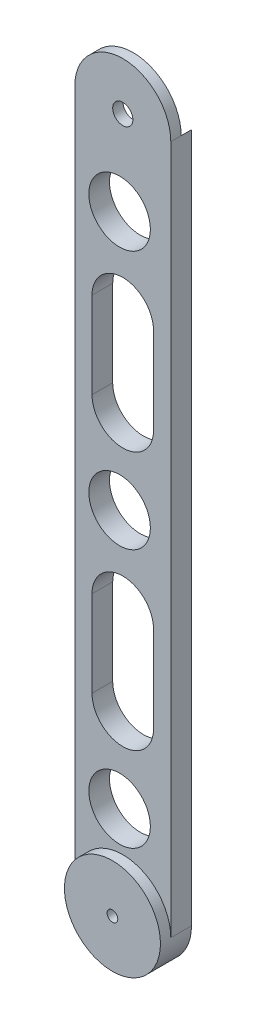
ISO-10303-21;
HEADER;
FILE_DESCRIPTION(('STEP AP214'),'2;1');
FILE_NAME('part.step','',(''),(''),'','','');
FILE_SCHEMA(('AUTOMOTIVE_DESIGN { 1 0 10303 214 1 1 1 1 }'));
ENDSEC;
DATA;
#1=APPLICATION_CONTEXT('core data for automotive mechanical design processes');
#2=APPLICATION_PROTOCOL_DEFINITION('international standard','automotive_design',2000,#1);
#3=PRODUCT_CONTEXT('',#1,'mechanical');
#4=PRODUCT('Part','Part','',(#3));
#5=PRODUCT_RELATED_PRODUCT_CATEGORY('part','',(#4));
#6=PRODUCT_DEFINITION_FORMATION('','',#4);
#7=PRODUCT_DEFINITION_CONTEXT('part definition',#1,'design');
#8=PRODUCT_DEFINITION('design','',#6,#7);
#9=PRODUCT_DEFINITION_SHAPE('','',#8);
#10=(LENGTH_UNIT() NAMED_UNIT(*) SI_UNIT(.MILLI.,.METRE.));
#11=(NAMED_UNIT(*) PLANE_ANGLE_UNIT() SI_UNIT($,.RADIAN.));
#12=(NAMED_UNIT(*) SI_UNIT($,.STERADIAN.) SOLID_ANGLE_UNIT());
#13=UNCERTAINTY_MEASURE_WITH_UNIT(LENGTH_MEASURE(1.E-05),#10,'distance_accuracy_value','');
#14=(GEOMETRIC_REPRESENTATION_CONTEXT(3) GLOBAL_UNCERTAINTY_ASSIGNED_CONTEXT((#13)) GLOBAL_UNIT_ASSIGNED_CONTEXT((#10,
#11,#12)) REPRESENTATION_CONTEXT('',''));
#15=CARTESIAN_POINT('',(0.,0.,0.));
#16=DIRECTION('',(0.,0.,1.));
#17=DIRECTION('',(1.,0.,0.));
#18=AXIS2_PLACEMENT_3D('',#15,#16,#17);
#19=CARTESIAN_POINT('',(3.96645272181372,-172.813095238095,0.));
#20=DIRECTION('',(0.,0.,1.));
#21=DIRECTION('',(1.,0.,0.));
#22=AXIS2_PLACEMENT_3D('',#19,#20,#21);
#23=CYLINDRICAL_SURFACE('',#22,1.55);
#24=CARTESIAN_POINT('',(3.96645272181372,-172.813095238095,9.));
#25=DIRECTION('',(0.,0.,1.));
#26=DIRECTION('',(1.,0.,0.));
#27=AXIS2_PLACEMENT_3D('',#24,#25,#26);
#28=CIRCLE('',#27,1.55);
#29=CARTESIAN_POINT('',(5.51645272181372,-172.813095238095,9.));
#30=VERTEX_POINT('',#29);
#31=EDGE_CURVE('E288',#30,#30,#28,.T.);
#32=ORIENTED_EDGE('',*,*,#31,.T.);
#33=EDGE_LOOP('',(#32));
#34=FACE_BOUND('',#33,.T.);
#35=CARTESIAN_POINT('',(3.96645272181372,-172.813095238095,2.5));
#36=DIRECTION('',(0.,0.,-1.));
#37=DIRECTION('',(-1.,0.,0.));
#38=AXIS2_PLACEMENT_3D('',#35,#36,#37);
#39=CIRCLE('',#38,1.55);
#40=CARTESIAN_POINT('',(2.41645272181372,-172.813095238095,2.5));
#41=VERTEX_POINT('',#40);
#42=EDGE_CURVE('E41',#41,#41,#39,.F.);
#43=ORIENTED_EDGE('',*,*,#42,.F.);
#44=EDGE_LOOP('',(#43));
#45=FACE_BOUND('',#44,.T.);
#46=ADVANCED_FACE('F37',(#34,#45),#23,.F.);
#47=CARTESIAN_POINT('',(3.9664527218137,27.1869047619048,6.));
#48=DIRECTION('',(0.,0.,-1.));
#49=DIRECTION('',(-1.,0.,0.));
#50=AXIS2_PLACEMENT_3D('',#47,#48,#49);
#51=CYLINDRICAL_SURFACE('',#50,13.925);
#52=CARTESIAN_POINT('',(3.9664527218137,27.1869047619048,3.));
#53=DIRECTION('',(0.,0.,-1.));
#54=DIRECTION('',(-1.,0.,0.));
#55=AXIS2_PLACEMENT_3D('',#52,#53,#54);
#56=CIRCLE('',#55,13.925);
#57=CARTESIAN_POINT('',(-9.9585472781863,27.1869047619048,3.));
#58=VERTEX_POINT('',#57);
#59=CARTESIAN_POINT('',(17.8914527218137,27.1869047619048,3.));
#60=VERTEX_POINT('',#59);
#61=EDGE_CURVE('E181',#58,#60,#56,.T.);
#62=ORIENTED_EDGE('',*,*,#61,.F.);
#63=DIRECTION('',(0.,0.,-1.));
#64=VECTOR('',#63,1.);
#65=CARTESIAN_POINT('',(-9.9585472781863,27.1869047619048,6.));
#66=LINE('',#65,#64);
#67=CARTESIAN_POINT('',(-9.9585472781863,27.1869047619048,6.));
#68=VERTEX_POINT('',#67);
#69=EDGE_CURVE('E46',#68,#58,#66,.T.);
#70=ORIENTED_EDGE('',*,*,#69,.F.);
#71=CARTESIAN_POINT('',(3.9664527218137,27.1869047619048,6.));
#72=DIRECTION('',(0.,0.,1.));
#73=DIRECTION('',(1.,0.,0.));
#74=AXIS2_PLACEMENT_3D('',#71,#72,#73);
#75=CIRCLE('',#74,13.925);
#76=CARTESIAN_POINT('',(17.8914527218137,27.1869047619048,6.));
#77=VERTEX_POINT('',#76);
#78=EDGE_CURVE('E269',#77,#68,#75,.T.);
#79=ORIENTED_EDGE('',*,*,#78,.F.);
#80=DIRECTION('',(0.,0.,-1.));
#81=VECTOR('',#80,1.);
#82=CARTESIAN_POINT('',(17.8914527218137,27.1869047619048,6.));
#83=LINE('',#82,#81);
#84=EDGE_CURVE('E11',#77,#60,#83,.T.);
#85=ORIENTED_EDGE('',*,*,#84,.T.);
#86=EDGE_LOOP('',(#62,#70,#79,#85));
#87=FACE_BOUND('',#86,.T.);
#88=ADVANCED_FACE('F335',(#87),#51,.T.);
#89=CARTESIAN_POINT('',(3.9664527218137,27.1869047619048,10.));
#90=DIRECTION('',(0.,0.,-1.));
#91=DIRECTION('',(-1.,0.,0.));
#92=AXIS2_PLACEMENT_3D('',#89,#90,#91);
#93=CYLINDRICAL_SURFACE('',#92,2.925);
#94=CARTESIAN_POINT('',(3.9664527218137,27.1869047619048,6.));
#95=DIRECTION('',(0.,0.,1.));
#96=DIRECTION('',(1.,0.,0.));
#97=AXIS2_PLACEMENT_3D('',#94,#95,#96);
#98=CIRCLE('',#97,2.925);
#99=CARTESIAN_POINT('',(6.8914527218137,27.1869047619048,6.));
#100=VERTEX_POINT('',#99);
#101=EDGE_CURVE('E144',#100,#100,#98,.T.);
#102=ORIENTED_EDGE('',*,*,#101,.T.);
#103=EDGE_LOOP('',(#102));
#104=FACE_BOUND('',#103,.T.);
#105=CARTESIAN_POINT('',(3.9664527218137,27.1869047619048,3.));
#106=DIRECTION('',(0.,0.,-1.));
#107=DIRECTION('',(-1.,0.,0.));
#108=AXIS2_PLACEMENT_3D('',#105,#106,#107);
#109=CIRCLE('',#108,2.925);
#110=CARTESIAN_POINT('',(1.0414527218137,27.1869047619048,3.));
#111=VERTEX_POINT('',#110);
#112=EDGE_CURVE('E145',#111,#111,#109,.F.);
#113=ORIENTED_EDGE('',*,*,#112,.F.);
#114=EDGE_LOOP('',(#113));
#115=FACE_BOUND('',#114,.T.);
#116=ADVANCED_FACE('F340',(#104,#115),#93,.F.);
#117=CARTESIAN_POINT('',(0.,0.,6.));
#118=DIRECTION('',(0.,0.,1.));
#119=DIRECTION('',(1.,0.,0.));
#120=AXIS2_PLACEMENT_3D('',#117,#118,#119);
#121=PLANE('',#120);
#122=ORIENTED_EDGE('',*,*,#101,.F.);
#123=EDGE_LOOP('',(#122));
#124=FACE_BOUND('',#123,.T.);
#125=CARTESIAN_POINT('',(3.04057135861746,-147.813095238095,6.));
#126=DIRECTION('',(0.,0.,1.));
#127=DIRECTION('',(1.,0.,0.));
#128=AXIS2_PLACEMENT_3D('',#125,#126,#127);
#129=CIRCLE('',#128,8.925);
#130=CARTESIAN_POINT('',(11.9655713586175,-147.813095238095,6.));
#131=VERTEX_POINT('',#130);
#132=EDGE_CURVE('E195',#131,#131,#129,.T.);
#133=ORIENTED_EDGE('',*,*,#132,.F.);
#134=EDGE_LOOP('',(#133));
#135=FACE_BOUND('',#134,.T.);
#136=CARTESIAN_POINT('',(3.9664527218137,-122.813095238095,6.));
#137=DIRECTION('',(0.,0.,1.));
#138=DIRECTION('',(1.,0.,0.));
#139=AXIS2_PLACEMENT_3D('',#136,#137,#138);
#140=CIRCLE('',#139,8.925);
#141=CARTESIAN_POINT('',(12.8914527218137,-122.813095238095,6.));
#142=VERTEX_POINT('',#141);
#143=CARTESIAN_POINT('',(-4.9585472781863,-122.813095238095,6.));
#144=VERTEX_POINT('',#143);
#145=EDGE_CURVE('E220',#142,#144,#140,.F.);
#146=ORIENTED_EDGE('',*,*,#145,.T.);
#147=DIRECTION('',(0.,1.,0.));
#148=VECTOR('',#147,1.);
#149=CARTESIAN_POINT('',(-4.95854727818629,0.,6.));
#150=LINE('',#149,#148);
#151=CARTESIAN_POINT('',(-4.9585472781863,-97.8130952380952,6.));
#152=VERTEX_POINT('',#151);
#153=EDGE_CURVE('E223',#144,#152,#150,.T.);
#154=ORIENTED_EDGE('',*,*,#153,.T.);
#155=CARTESIAN_POINT('',(3.9664527218137,-97.8130952380952,6.));
#156=DIRECTION('',(0.,0.,1.));
#157=DIRECTION('',(1.,0.,0.));
#158=AXIS2_PLACEMENT_3D('',#155,#156,#157);
#159=CIRCLE('',#158,8.925);
#160=CARTESIAN_POINT('',(12.8914527218137,-97.8130952380952,6.));
#161=VERTEX_POINT('',#160);
#162=EDGE_CURVE('E211',#152,#161,#159,.F.);
#163=ORIENTED_EDGE('',*,*,#162,.T.);
#164=DIRECTION('',(0.,1.,0.));
#165=VECTOR('',#164,1.);
#166=CARTESIAN_POINT('',(12.8914527218137,0.,6.));
#167=LINE('',#166,#165);
#168=EDGE_CURVE('E218',#142,#161,#167,.T.);
#169=ORIENTED_EDGE('',*,*,#168,.F.);
#170=EDGE_LOOP('',(#146,#154,#163,#169));
#171=FACE_BOUND('',#170,.T.);
#172=CARTESIAN_POINT('',(3.04057135861746,-72.8130952380952,6.));
#173=DIRECTION('',(0.,0.,1.));
#174=DIRECTION('',(1.,0.,0.));
#175=AXIS2_PLACEMENT_3D('',#172,#173,#174);
#176=CIRCLE('',#175,8.925);
#177=CARTESIAN_POINT('',(11.9655713586175,-72.8130952380952,6.));
#178=VERTEX_POINT('',#177);
#179=EDGE_CURVE('E229',#178,#178,#176,.T.);
#180=ORIENTED_EDGE('',*,*,#179,.F.);
#181=EDGE_LOOP('',(#180));
#182=FACE_BOUND('',#181,.T.);
#183=CARTESIAN_POINT('',(3.04057135861746,2.1869047619048,6.));
#184=DIRECTION('',(0.,0.,1.));
#185=DIRECTION('',(1.,0.,0.));
#186=AXIS2_PLACEMENT_3D('',#183,#184,#185);
#187=CIRCLE('',#186,8.925);
#188=CARTESIAN_POINT('',(11.9655713586175,2.1869047619048,6.));
#189=VERTEX_POINT('',#188);
#190=EDGE_CURVE('E167',#189,#189,#187,.T.);
#191=ORIENTED_EDGE('',*,*,#190,.F.);
#192=EDGE_LOOP('',(#191));
#193=FACE_BOUND('',#192,.T.);
#194=CARTESIAN_POINT('',(3.96645272181372,-172.813095238095,6.));
#195=DIRECTION('',(0.,0.,1.));
#196=DIRECTION('',(1.,0.,0.));
#197=AXIS2_PLACEMENT_3D('',#194,#195,#196);
#198=CIRCLE('',#197,13.925);
#199=CARTESIAN_POINT('',(17.8914527218137,-172.813095238095,6.));
#200=VERTEX_POINT('',#199);
#201=CARTESIAN_POINT('',(-9.95854727818629,-172.813095238095,6.));
#202=VERTEX_POINT('',#201);
#203=EDGE_CURVE('E162',#200,#202,#198,.T.);
#204=ORIENTED_EDGE('',*,*,#203,.F.);
#205=DIRECTION('',(0.,-1.,0.));
#206=VECTOR('',#205,1.);
#207=CARTESIAN_POINT('',(17.8914527218137,0.,6.));
#208=LINE('',#207,#206);
#209=EDGE_CURVE('E174',#77,#200,#208,.T.);
#210=ORIENTED_EDGE('',*,*,#209,.F.);
#211=ORIENTED_EDGE('',*,*,#78,.T.);
#212=DIRECTION('',(0.,-1.,0.));
#213=VECTOR('',#212,1.);
#214=CARTESIAN_POINT('',(-9.95854727818629,0.,6.));
#215=LINE('',#214,#213);
#216=EDGE_CURVE('E170',#68,#202,#215,.T.);
#217=ORIENTED_EDGE('',*,*,#216,.T.);
#218=EDGE_LOOP('',(#204,#210,#211,#217));
#219=FACE_BOUND('',#218,.T.);
#220=DIRECTION('',(0.,1.,0.));
#221=VECTOR('',#220,1.);
#222=CARTESIAN_POINT('',(-4.95854727818629,0.,6.));
#223=LINE('',#222,#221);
#224=CARTESIAN_POINT('',(-4.9585472781863,-47.8130952380952,6.));
#225=VERTEX_POINT('',#224);
#226=CARTESIAN_POINT('',(-4.9585472781863,-22.8130952380952,6.));
#227=VERTEX_POINT('',#226);
#228=EDGE_CURVE('E258',#225,#227,#223,.T.);
#229=ORIENTED_EDGE('',*,*,#228,.T.);
#230=CARTESIAN_POINT('',(3.9664527218137,-22.8130952380952,6.));
#231=DIRECTION('',(0.,0.,1.));
#232=DIRECTION('',(1.,0.,0.));
#233=AXIS2_PLACEMENT_3D('',#230,#231,#232);
#234=CIRCLE('',#233,8.925);
#235=CARTESIAN_POINT('',(12.8914527218137,-22.8130952380952,6.));
#236=VERTEX_POINT('',#235);
#237=EDGE_CURVE('E261',#227,#236,#234,.F.);
#238=ORIENTED_EDGE('',*,*,#237,.T.);
#239=DIRECTION('',(0.,1.,0.));
#240=VECTOR('',#239,1.);
#241=CARTESIAN_POINT('',(12.8914527218137,0.,6.));
#242=LINE('',#241,#240);
#243=CARTESIAN_POINT('',(12.8914527218137,-47.8130952380952,6.));
#244=VERTEX_POINT('',#243);
#245=EDGE_CURVE('E247',#244,#236,#242,.T.);
#246=ORIENTED_EDGE('',*,*,#245,.F.);
#247=CARTESIAN_POINT('',(3.9664527218137,-47.8130952380952,6.));
#248=DIRECTION('',(0.,0.,1.));
#249=DIRECTION('',(1.,0.,0.));
#250=AXIS2_PLACEMENT_3D('',#247,#248,#249);
#251=CIRCLE('',#250,8.925);
#252=EDGE_CURVE('E255',#244,#225,#251,.F.);
#253=ORIENTED_EDGE('',*,*,#252,.T.);
#254=EDGE_LOOP('',(#229,#238,#246,#253));
#255=FACE_BOUND('',#254,.T.);
#256=ADVANCED_FACE('F276',(#124,#135,#171,#182,#193,#219,#255),#121,.T.);
#257=CARTESIAN_POINT('',(0.,0.,0.));
#258=DIRECTION('',(0.,0.,1.));
#259=DIRECTION('',(1.,0.,0.));
#260=AXIS2_PLACEMENT_3D('',#257,#258,#259);
#261=PLANE('',#260);
#262=CARTESIAN_POINT('',(3.96645272181372,-172.813095238095,0.));
#263=DIRECTION('',(0.,0.,-1.));
#264=DIRECTION('',(-1.,0.,0.));
#265=AXIS2_PLACEMENT_3D('',#262,#263,#264);
#266=CIRCLE('',#265,4.);
#267=CARTESIAN_POINT('',(-0.0335472781862771,-172.813095238095,0.));
#268=VERTEX_POINT('',#267);
#269=EDGE_CURVE('E295',#268,#268,#266,.T.);
#270=ORIENTED_EDGE('',*,*,#269,.F.);
#271=EDGE_LOOP('',(#270));
#272=FACE_BOUND('',#271,.T.);
#273=CARTESIAN_POINT('',(3.04057135861746,-147.813095238095,0.));
#274=DIRECTION('',(0.,0.,-1.));
#275=DIRECTION('',(-1.,0.,0.));
#276=AXIS2_PLACEMENT_3D('',#273,#274,#275);
#277=CIRCLE('',#276,8.925);
#278=CARTESIAN_POINT('',(-5.88442864138254,-147.813095238095,0.));
#279=VERTEX_POINT('',#278);
#280=EDGE_CURVE('E192',#279,#279,#277,.T.);
#281=ORIENTED_EDGE('',*,*,#280,.F.);
#282=EDGE_LOOP('',(#281));
#283=FACE_BOUND('',#282,.T.);
#284=DIRECTION('',(0.,-1.,0.));
#285=VECTOR('',#284,1.);
#286=CARTESIAN_POINT('',(-4.95854727818629,0.,0.));
#287=LINE('',#286,#285);
#288=CARTESIAN_POINT('',(-4.9585472781863,-97.8130952380952,0.));
#289=VERTEX_POINT('',#288);
#290=CARTESIAN_POINT('',(-4.9585472781863,-122.813095238095,0.));
#291=VERTEX_POINT('',#290);
#292=EDGE_CURVE('E62',#289,#291,#287,.T.);
#293=ORIENTED_EDGE('',*,*,#292,.T.);
#294=CARTESIAN_POINT('',(3.9664527218137,-122.813095238095,0.));
#295=DIRECTION('',(0.,0.,-1.));
#296=DIRECTION('',(-1.,0.,0.));
#297=AXIS2_PLACEMENT_3D('',#294,#295,#296);
#298=CIRCLE('',#297,8.925);
#299=CARTESIAN_POINT('',(12.8914527218137,-122.813095238095,0.));
#300=VERTEX_POINT('',#299);
#301=EDGE_CURVE('E205',#291,#300,#298,.F.);
#302=ORIENTED_EDGE('',*,*,#301,.T.);
#303=DIRECTION('',(0.,-1.,0.));
#304=VECTOR('',#303,1.);
#305=CARTESIAN_POINT('',(12.8914527218137,0.,0.));
#306=LINE('',#305,#304);
#307=CARTESIAN_POINT('',(12.8914527218137,-97.8130952380952,0.));
#308=VERTEX_POINT('',#307);
#309=EDGE_CURVE('E202',#308,#300,#306,.T.);
#310=ORIENTED_EDGE('',*,*,#309,.F.);
#311=CARTESIAN_POINT('',(3.9664527218137,-97.8130952380952,0.));
#312=DIRECTION('',(0.,0.,-1.));
#313=DIRECTION('',(-1.,0.,0.));
#314=AXIS2_PLACEMENT_3D('',#311,#312,#313);
#315=CIRCLE('',#314,8.925);
#316=EDGE_CURVE('E199',#308,#289,#315,.F.);
#317=ORIENTED_EDGE('',*,*,#316,.T.);
#318=EDGE_LOOP('',(#293,#302,#310,#317));
#319=FACE_BOUND('',#318,.T.);
#320=CARTESIAN_POINT('',(3.04057135861746,-72.8130952380952,0.));
#321=DIRECTION('',(0.,0.,-1.));
#322=DIRECTION('',(-1.,0.,0.));
#323=AXIS2_PLACEMENT_3D('',#320,#321,#322);
#324=CIRCLE('',#323,8.925);
#325=CARTESIAN_POINT('',(-5.88442864138254,-72.8130952380952,0.));
#326=VERTEX_POINT('',#325);
#327=EDGE_CURVE('E226',#326,#326,#324,.T.);
#328=ORIENTED_EDGE('',*,*,#327,.F.);
#329=EDGE_LOOP('',(#328));
#330=FACE_BOUND('',#329,.T.);
#331=DIRECTION('',(0.,-1.,0.));
#332=VECTOR('',#331,1.);
#333=CARTESIAN_POINT('',(-9.95854727818629,0.,0.));
#334=LINE('',#333,#332);
#335=CARTESIAN_POINT('',(-9.9585472781863,27.1869047619048,0.));
#336=VERTEX_POINT('',#335);
#337=CARTESIAN_POINT('',(-9.95854727818627,-172.813095238095,0.));
#338=VERTEX_POINT('',#337);
#339=EDGE_CURVE('E155',#336,#338,#334,.T.);
#340=ORIENTED_EDGE('',*,*,#339,.F.);
#341=CARTESIAN_POINT('',(3.9664527218137,27.1869047619048,0.));
#342=DIRECTION('',(0.,0.,-1.));
#343=DIRECTION('',(-1.,0.,0.));
#344=AXIS2_PLACEMENT_3D('',#341,#342,#343);
#345=CIRCLE('',#344,13.925);
#346=CARTESIAN_POINT('',(17.8914527218137,27.1869047619048,0.));
#347=VERTEX_POINT('',#346);
#348=EDGE_CURVE('E137',#347,#336,#345,.T.);
#349=ORIENTED_EDGE('',*,*,#348,.F.);
#350=DIRECTION('',(0.,-1.,0.));
#351=VECTOR('',#350,1.);
#352=CARTESIAN_POINT('',(17.8914527218137,0.,0.));
#353=LINE('',#352,#351);
#354=CARTESIAN_POINT('',(17.8914527218137,-172.813095238095,0.));
#355=VERTEX_POINT('',#354);
#356=EDGE_CURVE('E153',#347,#355,#353,.T.);
#357=ORIENTED_EDGE('',*,*,#356,.T.);
#358=CARTESIAN_POINT('',(3.96645272181372,-172.813095238095,0.));
#359=DIRECTION('',(0.,0.,1.));
#360=DIRECTION('',(1.,0.,0.));
#361=AXIS2_PLACEMENT_3D('',#358,#359,#360);
#362=CIRCLE('',#361,13.925);
#363=EDGE_CURVE('E164',#338,#355,#362,.T.);
#364=ORIENTED_EDGE('',*,*,#363,.F.);
#365=EDGE_LOOP('',(#340,#349,#357,#364));
#366=FACE_BOUND('',#365,.T.);
#367=CARTESIAN_POINT('',(3.04057135861746,2.1869047619048,0.));
#368=DIRECTION('',(0.,0.,-1.));
#369=DIRECTION('',(-1.,0.,0.));
#370=AXIS2_PLACEMENT_3D('',#367,#368,#369);
#371=CIRCLE('',#370,8.925);
#372=CARTESIAN_POINT('',(-5.88442864138254,2.1869047619048,0.));
#373=VERTEX_POINT('',#372);
#374=EDGE_CURVE('E264',#373,#373,#371,.T.);
#375=ORIENTED_EDGE('',*,*,#374,.F.);
#376=EDGE_LOOP('',(#375));
#377=FACE_BOUND('',#376,.T.);
#378=CARTESIAN_POINT('',(3.9664527218137,-22.8130952380952,0.));
#379=DIRECTION('',(0.,0.,-1.));
#380=DIRECTION('',(-1.,0.,0.));
#381=AXIS2_PLACEMENT_3D('',#378,#379,#380);
#382=CIRCLE('',#381,8.925);
#383=CARTESIAN_POINT('',(12.8914527218137,-22.8130952380952,0.));
#384=VERTEX_POINT('',#383);
#385=CARTESIAN_POINT('',(-4.9585472781863,-22.8130952380952,0.));
#386=VERTEX_POINT('',#385);
#387=EDGE_CURVE('E232',#384,#386,#382,.F.);
#388=ORIENTED_EDGE('',*,*,#387,.T.);
#389=DIRECTION('',(0.,-1.,0.));
#390=VECTOR('',#389,1.);
#391=CARTESIAN_POINT('',(-4.95854727818629,0.,0.));
#392=LINE('',#391,#390);
#393=CARTESIAN_POINT('',(-4.9585472781863,-47.8130952380952,0.));
#394=VERTEX_POINT('',#393);
#395=EDGE_CURVE('E241',#386,#394,#392,.T.);
#396=ORIENTED_EDGE('',*,*,#395,.T.);
#397=CARTESIAN_POINT('',(3.9664527218137,-47.8130952380952,0.));
#398=DIRECTION('',(0.,0.,-1.));
#399=DIRECTION('',(-1.,0.,0.));
#400=AXIS2_PLACEMENT_3D('',#397,#398,#399);
#401=CIRCLE('',#400,8.925);
#402=CARTESIAN_POINT('',(12.8914527218137,-47.8130952380952,0.));
#403=VERTEX_POINT('',#402);
#404=EDGE_CURVE('E238',#394,#403,#401,.F.);
#405=ORIENTED_EDGE('',*,*,#404,.T.);
#406=DIRECTION('',(0.,-1.,0.));
#407=VECTOR('',#406,1.);
#408=CARTESIAN_POINT('',(12.8914527218137,0.,0.));
#409=LINE('',#408,#407);
#410=EDGE_CURVE('E235',#384,#403,#409,.T.);
#411=ORIENTED_EDGE('',*,*,#410,.F.);
#412=EDGE_LOOP('',(#388,#396,#405,#411));
#413=FACE_BOUND('',#412,.T.);
#414=ADVANCED_FACE('F150',(#272,#283,#319,#330,#366,#377,#413),#261,.F.);
#415=CARTESIAN_POINT('',(3.96645272181372,-172.813095238095,6.));
#416=DIRECTION('',(0.,0.,-1.));
#417=DIRECTION('',(-1.,0.,0.));
#418=AXIS2_PLACEMENT_3D('',#415,#416,#417);
#419=CYLINDRICAL_SURFACE('',#418,13.925);
#420=ORIENTED_EDGE('',*,*,#363,.T.);
#421=DIRECTION('',(0.,0.,-1.));
#422=VECTOR('',#421,1.);
#423=CARTESIAN_POINT('',(17.8914527218137,-172.813095238095,6.));
#424=LINE('',#423,#422);
#425=EDGE_CURVE('E160',#200,#355,#424,.T.);
#426=ORIENTED_EDGE('',*,*,#425,.F.);
#427=ORIENTED_EDGE('',*,*,#203,.T.);
#428=DIRECTION('',(0.,0.,-1.));
#429=VECTOR('',#428,1.);
#430=CARTESIAN_POINT('',(-9.95854727818627,-172.813095238095,6.));
#431=LINE('',#430,#429);
#432=EDGE_CURVE('E176',#202,#338,#431,.T.);
#433=ORIENTED_EDGE('',*,*,#432,.T.);
#434=EDGE_LOOP('',(#420,#426,#427,#433));
#435=FACE_BOUND('',#434,.T.);
#436=CARTESIAN_POINT('',(3.96645272181372,-172.813095238095,9.));
#437=DIRECTION('',(0.,0.,1.));
#438=DIRECTION('',(1.,0.,0.));
#439=AXIS2_PLACEMENT_3D('',#436,#437,#438);
#440=CIRCLE('',#439,13.925);
#441=CARTESIAN_POINT('',(17.8914527218137,-172.813095238095,9.));
#442=VERTEX_POINT('',#441);
#443=EDGE_CURVE('E156',#442,#442,#440,.T.);
#444=ORIENTED_EDGE('',*,*,#443,.F.);
#445=EDGE_LOOP('',(#444));
#446=FACE_BOUND('',#445,.T.);
#447=ADVANCED_FACE('F281',(#435,#446),#419,.T.);
#448=CARTESIAN_POINT('',(17.8914527218137,0.,6.));
#449=DIRECTION('',(1.,0.,0.));
#450=DIRECTION('',(0.,1.,0.));
#451=AXIS2_PLACEMENT_3D('',#448,#449,#450);
#452=PLANE('',#451);
#453=ORIENTED_EDGE('',*,*,#356,.F.);
#454=DIRECTION('',(0.,0.,-1.));
#455=VECTOR('',#454,1.);
#456=CARTESIAN_POINT('',(17.8914527218137,27.1869047619048,3.));
#457=LINE('',#456,#455);
#458=EDGE_CURVE('E134',#60,#347,#457,.T.);
#459=ORIENTED_EDGE('',*,*,#458,.F.);
#460=ORIENTED_EDGE('',*,*,#84,.F.);
#461=ORIENTED_EDGE('',*,*,#209,.T.);
#462=ORIENTED_EDGE('',*,*,#425,.T.);
#463=EDGE_LOOP('',(#453,#459,#460,#461,#462));
#464=FACE_BOUND('',#463,.T.);
#465=ADVANCED_FACE('F39',(#464),#452,.T.);
#466=CARTESIAN_POINT('',(-9.95854727818629,0.,6.));
#467=DIRECTION('',(1.,0.,0.));
#468=DIRECTION('',(0.,1.,0.));
#469=AXIS2_PLACEMENT_3D('',#466,#467,#468);
#470=PLANE('',#469);
#471=ORIENTED_EDGE('',*,*,#339,.T.);
#472=ORIENTED_EDGE('',*,*,#432,.F.);
#473=ORIENTED_EDGE('',*,*,#216,.F.);
#474=ORIENTED_EDGE('',*,*,#69,.T.);
#475=EDGE_CURVE('E178',#58,#336,#66,.T.);
#476=ORIENTED_EDGE('',*,*,#475,.T.);
#477=EDGE_LOOP('',(#471,#472,#473,#474,#476));
#478=FACE_BOUND('',#477,.T.);
#479=ADVANCED_FACE('F279',(#478),#470,.F.);
#480=CARTESIAN_POINT('',(3.04057135861746,2.1869047619048,10.));
#481=DIRECTION('',(0.,0.,-1.));
#482=DIRECTION('',(-1.,0.,0.));
#483=AXIS2_PLACEMENT_3D('',#480,#481,#482);
#484=CYLINDRICAL_SURFACE('',#483,8.925);
#485=ORIENTED_EDGE('',*,*,#190,.T.);
#486=EDGE_LOOP('',(#485));
#487=FACE_BOUND('',#486,.T.);
#488=ORIENTED_EDGE('',*,*,#374,.T.);
#489=EDGE_LOOP('',(#488));
#490=FACE_BOUND('',#489,.T.);
#491=ADVANCED_FACE('F345',(#487,#490),#484,.F.);
#492=CARTESIAN_POINT('',(3.9664527218137,-22.8130952380952,10.));
#493=DIRECTION('',(0.,0.,-1.));
#494=DIRECTION('',(-1.,0.,0.));
#495=AXIS2_PLACEMENT_3D('',#492,#493,#494);
#496=CYLINDRICAL_SURFACE('',#495,8.925);
#497=DIRECTION('',(0.,0.,-1.));
#498=VECTOR('',#497,1.);
#499=CARTESIAN_POINT('',(-4.9585472781863,-22.8130952380952,10.));
#500=LINE('',#499,#498);
#501=EDGE_CURVE('E245',#227,#386,#500,.T.);
#502=ORIENTED_EDGE('',*,*,#501,.T.);
#503=ORIENTED_EDGE('',*,*,#387,.F.);
#504=DIRECTION('',(0.,0.,-1.));
#505=VECTOR('',#504,1.);
#506=CARTESIAN_POINT('',(12.8914527218137,-22.8130952380952,10.));
#507=LINE('',#506,#505);
#508=EDGE_CURVE('E244',#236,#384,#507,.T.);
#509=ORIENTED_EDGE('',*,*,#508,.F.);
#510=ORIENTED_EDGE('',*,*,#237,.F.);
#511=EDGE_LOOP('',(#502,#503,#509,#510));
#512=FACE_BOUND('',#511,.T.);
#513=ADVANCED_FACE('F355',(#512),#496,.F.);
#514=CARTESIAN_POINT('',(-4.95854727818629,0.,10.));
#515=DIRECTION('',(1.,0.,0.));
#516=DIRECTION('',(0.,1.,0.));
#517=AXIS2_PLACEMENT_3D('',#514,#515,#516);
#518=PLANE('',#517);
#519=DIRECTION('',(0.,0.,-1.));
#520=VECTOR('',#519,1.);
#521=CARTESIAN_POINT('',(-4.9585472781863,-47.8130952380952,10.));
#522=LINE('',#521,#520);
#523=EDGE_CURVE('E248',#225,#394,#522,.T.);
#524=ORIENTED_EDGE('',*,*,#523,.T.);
#525=ORIENTED_EDGE('',*,*,#395,.F.);
#526=ORIENTED_EDGE('',*,*,#501,.F.);
#527=ORIENTED_EDGE('',*,*,#228,.F.);
#528=EDGE_LOOP('',(#524,#525,#526,#527));
#529=FACE_BOUND('',#528,.T.);
#530=ADVANCED_FACE('F451',(#529),#518,.T.);
#531=CARTESIAN_POINT('',(3.9664527218137,-47.8130952380952,10.));
#532=DIRECTION('',(0.,0.,-1.));
#533=DIRECTION('',(-1.,0.,0.));
#534=AXIS2_PLACEMENT_3D('',#531,#532,#533);
#535=CYLINDRICAL_SURFACE('',#534,8.925);
#536=DIRECTION('',(0.,0.,-1.));
#537=VECTOR('',#536,1.);
#538=CARTESIAN_POINT('',(12.8914527218137,-47.8130952380952,10.));
#539=LINE('',#538,#537);
#540=EDGE_CURVE('E250',#244,#403,#539,.T.);
#541=ORIENTED_EDGE('',*,*,#540,.T.);
#542=ORIENTED_EDGE('',*,*,#404,.F.);
#543=ORIENTED_EDGE('',*,*,#523,.F.);
#544=ORIENTED_EDGE('',*,*,#252,.F.);
#545=EDGE_LOOP('',(#541,#542,#543,#544));
#546=FACE_BOUND('',#545,.T.);
#547=ADVANCED_FACE('F330',(#546),#535,.F.);
#548=CARTESIAN_POINT('',(12.8914527218137,0.,10.));
#549=DIRECTION('',(1.,0.,0.));
#550=DIRECTION('',(0.,1.,0.));
#551=AXIS2_PLACEMENT_3D('',#548,#549,#550);
#552=PLANE('',#551);
#553=ORIENTED_EDGE('',*,*,#245,.T.);
#554=ORIENTED_EDGE('',*,*,#508,.T.);
#555=ORIENTED_EDGE('',*,*,#410,.T.);
#556=ORIENTED_EDGE('',*,*,#540,.F.);
#557=EDGE_LOOP('',(#553,#554,#555,#556));
#558=FACE_BOUND('',#557,.T.);
#559=ADVANCED_FACE('F321',(#558),#552,.F.);
#560=CARTESIAN_POINT('',(3.04057135861746,-72.8130952380952,10.));
#561=DIRECTION('',(0.,0.,-1.));
#562=DIRECTION('',(-1.,0.,0.));
#563=AXIS2_PLACEMENT_3D('',#560,#561,#562);
#564=CYLINDRICAL_SURFACE('',#563,8.925);
#565=ORIENTED_EDGE('',*,*,#179,.T.);
#566=EDGE_LOOP('',(#565));
#567=FACE_BOUND('',#566,.T.);
#568=ORIENTED_EDGE('',*,*,#327,.T.);
#569=EDGE_LOOP('',(#568));
#570=FACE_BOUND('',#569,.T.);
#571=ADVANCED_FACE('F318',(#567,#570),#564,.F.);
#572=CARTESIAN_POINT('',(-4.95854727818629,0.,10.));
#573=DIRECTION('',(1.,0.,0.));
#574=DIRECTION('',(0.,1.,0.));
#575=AXIS2_PLACEMENT_3D('',#572,#573,#574);
#576=PLANE('',#575);
#577=DIRECTION('',(0.,0.,-1.));
#578=VECTOR('',#577,1.);
#579=CARTESIAN_POINT('',(-4.9585472781863,-122.813095238095,10.));
#580=LINE('',#579,#578);
#581=EDGE_CURVE('E209',#144,#291,#580,.T.);
#582=ORIENTED_EDGE('',*,*,#581,.T.);
#583=ORIENTED_EDGE('',*,*,#292,.F.);
#584=DIRECTION('',(0.,0.,-1.));
#585=VECTOR('',#584,1.);
#586=CARTESIAN_POINT('',(-4.9585472781863,-97.8130952380952,10.));
#587=LINE('',#586,#585);
#588=EDGE_CURVE('E208',#152,#289,#587,.T.);
#589=ORIENTED_EDGE('',*,*,#588,.F.);
#590=ORIENTED_EDGE('',*,*,#153,.F.);
#591=EDGE_LOOP('',(#582,#583,#589,#590));
#592=FACE_BOUND('',#591,.T.);
#593=ADVANCED_FACE('F320',(#592),#576,.T.);
#594=CARTESIAN_POINT('',(3.9664527218137,-122.813095238095,10.));
#595=DIRECTION('',(0.,0.,-1.));
#596=DIRECTION('',(-1.,0.,0.));
#597=AXIS2_PLACEMENT_3D('',#594,#595,#596);
#598=CYLINDRICAL_SURFACE('',#597,8.925);
#599=DIRECTION('',(0.,0.,-1.));
#600=VECTOR('',#599,1.);
#601=CARTESIAN_POINT('',(12.8914527218137,-122.813095238095,10.));
#602=LINE('',#601,#600);
#603=EDGE_CURVE('E212',#142,#300,#602,.T.);
#604=ORIENTED_EDGE('',*,*,#603,.T.);
#605=ORIENTED_EDGE('',*,*,#301,.F.);
#606=ORIENTED_EDGE('',*,*,#581,.F.);
#607=ORIENTED_EDGE('',*,*,#145,.F.);
#608=EDGE_LOOP('',(#604,#605,#606,#607));
#609=FACE_BOUND('',#608,.T.);
#610=ADVANCED_FACE('F328',(#609),#598,.F.);
#611=CARTESIAN_POINT('',(12.8914527218137,0.,10.));
#612=DIRECTION('',(1.,0.,0.));
#613=DIRECTION('',(0.,1.,0.));
#614=AXIS2_PLACEMENT_3D('',#611,#612,#613);
#615=PLANE('',#614);
#616=ORIENTED_EDGE('',*,*,#168,.T.);
#617=DIRECTION('',(0.,0.,-1.));
#618=VECTOR('',#617,1.);
#619=CARTESIAN_POINT('',(12.8914527218137,-97.8130952380952,10.));
#620=LINE('',#619,#618);
#621=EDGE_CURVE('E54',#161,#308,#620,.T.);
#622=ORIENTED_EDGE('',*,*,#621,.T.);
#623=ORIENTED_EDGE('',*,*,#309,.T.);
#624=ORIENTED_EDGE('',*,*,#603,.F.);
#625=EDGE_LOOP('',(#616,#622,#623,#624));
#626=FACE_BOUND('',#625,.T.);
#627=ADVANCED_FACE('F408',(#626),#615,.F.);
#628=CARTESIAN_POINT('',(3.9664527218137,-97.8130952380952,10.));
#629=DIRECTION('',(0.,0.,-1.));
#630=DIRECTION('',(-1.,0.,0.));
#631=AXIS2_PLACEMENT_3D('',#628,#629,#630);
#632=CYLINDRICAL_SURFACE('',#631,8.925);
#633=ORIENTED_EDGE('',*,*,#588,.T.);
#634=ORIENTED_EDGE('',*,*,#316,.F.);
#635=ORIENTED_EDGE('',*,*,#621,.F.);
#636=ORIENTED_EDGE('',*,*,#162,.F.);
#637=EDGE_LOOP('',(#633,#634,#635,#636));
#638=FACE_BOUND('',#637,.T.);
#639=ADVANCED_FACE('F397',(#638),#632,.F.);
#640=CARTESIAN_POINT('',(3.04057135861746,-147.813095238095,10.));
#641=DIRECTION('',(0.,0.,-1.));
#642=DIRECTION('',(-1.,0.,0.));
#643=AXIS2_PLACEMENT_3D('',#640,#641,#642);
#644=CYLINDRICAL_SURFACE('',#643,8.925);
#645=ORIENTED_EDGE('',*,*,#132,.T.);
#646=EDGE_LOOP('',(#645));
#647=FACE_BOUND('',#646,.T.);
#648=ORIENTED_EDGE('',*,*,#280,.T.);
#649=EDGE_LOOP('',(#648));
#650=FACE_BOUND('',#649,.T.);
#651=ADVANCED_FACE('F391',(#647,#650),#644,.F.);
#652=CARTESIAN_POINT('',(3.9664527218137,27.1869047619048,3.));
#653=DIRECTION('',(0.,0.,-1.));
#654=DIRECTION('',(-1.,0.,0.));
#655=AXIS2_PLACEMENT_3D('',#652,#653,#654);
#656=PLANE('',#655);
#657=ORIENTED_EDGE('',*,*,#61,.T.);
#658=EDGE_CURVE('E140',#60,#58,#56,.T.);
#659=ORIENTED_EDGE('',*,*,#658,.T.);
#660=EDGE_LOOP('',(#657,#659));
#661=FACE_BOUND('',#660,.T.);
#662=ORIENTED_EDGE('',*,*,#112,.T.);
#663=EDGE_LOOP('',(#662));
#664=FACE_BOUND('',#663,.T.);
#665=ADVANCED_FACE('F396',(#661,#664),#656,.T.);
#666=CARTESIAN_POINT('',(3.9664527218137,27.1869047619048,3.));
#667=DIRECTION('',(0.,0.,-1.));
#668=DIRECTION('',(-1.,0.,0.));
#669=AXIS2_PLACEMENT_3D('',#666,#667,#668);
#670=CYLINDRICAL_SURFACE('',#669,13.925);
#671=ORIENTED_EDGE('',*,*,#458,.T.);
#672=ORIENTED_EDGE('',*,*,#348,.T.);
#673=ORIENTED_EDGE('',*,*,#475,.F.);
#674=ORIENTED_EDGE('',*,*,#658,.F.);
#675=EDGE_LOOP('',(#671,#672,#673,#674));
#676=FACE_BOUND('',#675,.T.);
#677=ADVANCED_FACE('F136',(#676),#670,.F.);
#678=CARTESIAN_POINT('',(3.96645272181372,-172.813095238095,9.));
#679=DIRECTION('',(0.,0.,1.));
#680=DIRECTION('',(1.,0.,0.));
#681=AXIS2_PLACEMENT_3D('',#678,#679,#680);
#682=PLANE('',#681);
#683=ORIENTED_EDGE('',*,*,#443,.T.);
#684=EDGE_LOOP('',(#683));
#685=FACE_BOUND('',#684,.T.);
#686=ORIENTED_EDGE('',*,*,#31,.F.);
#687=EDGE_LOOP('',(#686));
#688=FACE_BOUND('',#687,.T.);
#689=ADVANCED_FACE('F508',(#685,#688),#682,.T.);
#690=CARTESIAN_POINT('',(3.96645272181372,-172.813095238095,2.5));
#691=DIRECTION('',(0.,0.,-1.));
#692=DIRECTION('',(-1.,0.,0.));
#693=AXIS2_PLACEMENT_3D('',#690,#691,#692);
#694=PLANE('',#693);
#695=CARTESIAN_POINT('',(3.96645272181372,-172.813095238095,2.5));
#696=DIRECTION('',(0.,0.,-1.));
#697=DIRECTION('',(-1.,0.,0.));
#698=AXIS2_PLACEMENT_3D('',#695,#696,#697);
#699=CIRCLE('',#698,4.);
#700=CARTESIAN_POINT('',(-0.0335472781862771,-172.813095238095,2.5));
#701=VERTEX_POINT('',#700);
#702=EDGE_CURVE('E293',#701,#701,#699,.T.);
#703=ORIENTED_EDGE('',*,*,#702,.T.);
#704=EDGE_LOOP('',(#703));
#705=FACE_BOUND('',#704,.T.);
#706=ORIENTED_EDGE('',*,*,#42,.T.);
#707=EDGE_LOOP('',(#706));
#708=FACE_BOUND('',#707,.T.);
#709=ADVANCED_FACE('F301',(#705,#708),#694,.T.);
#710=CARTESIAN_POINT('',(3.96645272181372,-172.813095238095,2.5));
#711=DIRECTION('',(0.,0.,-1.));
#712=DIRECTION('',(-1.,0.,0.));
#713=AXIS2_PLACEMENT_3D('',#710,#711,#712);
#714=CYLINDRICAL_SURFACE('',#713,4.);
#715=ORIENTED_EDGE('',*,*,#702,.F.);
#716=EDGE_LOOP('',(#715));
#717=FACE_BOUND('',#716,.T.);
#718=ORIENTED_EDGE('',*,*,#269,.T.);
#719=EDGE_LOOP('',(#718));
#720=FACE_BOUND('',#719,.T.);
#721=ADVANCED_FACE('F304',(#717,#720),#714,.F.);
#722=CLOSED_SHELL('',(#46,#88,#116,#256,#414,#447,#465,#479,#491,#513,#530,#547,#559,#571,#593,
#610,#627,#639,#651,#665,#677,#689,#709,#721));
#723=MANIFOLD_SOLID_BREP('B2',#722);
#724=ADVANCED_BREP_SHAPE_REPRESENTATION('',(#18,#723),#14);
#725=SHAPE_DEFINITION_REPRESENTATION(#9,#724);
ENDSEC;
END-ISO-10303-21;
